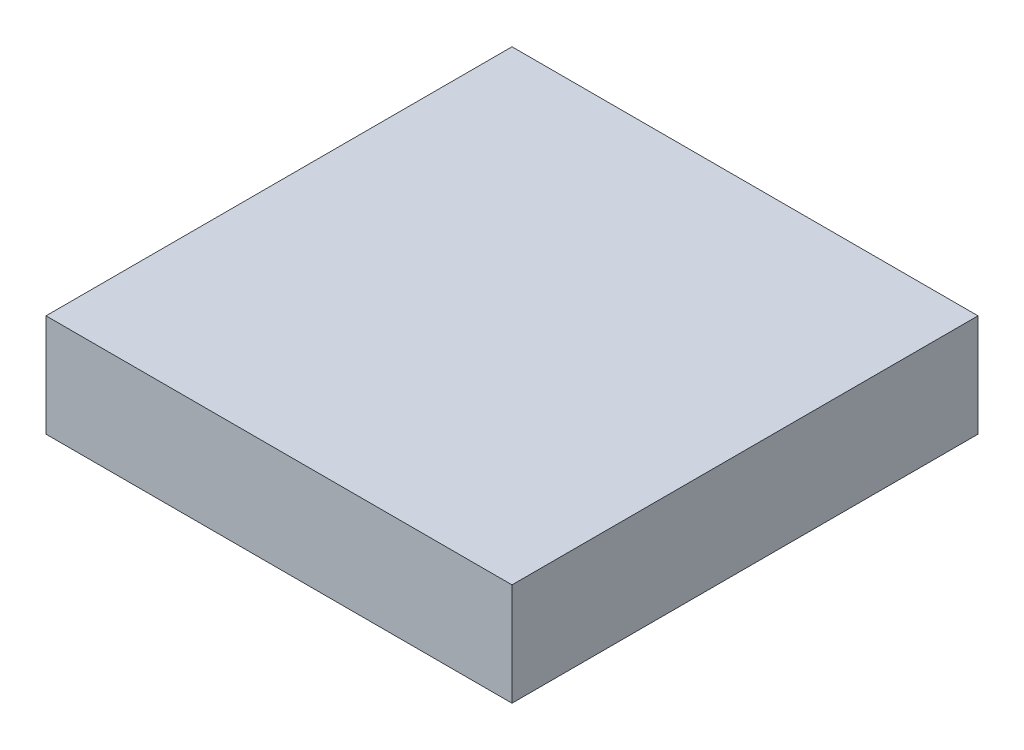
ISO-10303-21;
HEADER;
FILE_DESCRIPTION(('STEP AP214'),'2;1');
FILE_NAME('part.step','',(''),(''),'','','');
FILE_SCHEMA(('AUTOMOTIVE_DESIGN { 1 0 10303 214 1 1 1 1 }'));
ENDSEC;
DATA;
#1=APPLICATION_CONTEXT('core data for automotive mechanical design processes');
#2=APPLICATION_PROTOCOL_DEFINITION('international standard','automotive_design',2000,#1);
#3=PRODUCT_CONTEXT('',#1,'mechanical');
#4=PRODUCT('Part','Part','',(#3));
#5=PRODUCT_RELATED_PRODUCT_CATEGORY('part','',(#4));
#6=PRODUCT_DEFINITION_FORMATION('','',#4);
#7=PRODUCT_DEFINITION_CONTEXT('part definition',#1,'design');
#8=PRODUCT_DEFINITION('design','',#6,#7);
#9=PRODUCT_DEFINITION_SHAPE('','',#8);
#10=(LENGTH_UNIT() NAMED_UNIT(*) SI_UNIT(.MILLI.,.METRE.));
#11=(NAMED_UNIT(*) PLANE_ANGLE_UNIT() SI_UNIT($,.RADIAN.));
#12=(NAMED_UNIT(*) SI_UNIT($,.STERADIAN.) SOLID_ANGLE_UNIT());
#13=UNCERTAINTY_MEASURE_WITH_UNIT(LENGTH_MEASURE(1.E-05),#10,'distance_accuracy_value','');
#14=(GEOMETRIC_REPRESENTATION_CONTEXT(3) GLOBAL_UNCERTAINTY_ASSIGNED_CONTEXT((#13)) GLOBAL_UNIT_ASSIGNED_CONTEXT((#10,
#11,#12)) REPRESENTATION_CONTEXT('',''));
#15=CARTESIAN_POINT('',(0.,0.,0.));
#16=DIRECTION('',(0.,0.,1.));
#17=DIRECTION('',(1.,0.,0.));
#18=AXIS2_PLACEMENT_3D('',#15,#16,#17);
#19=CARTESIAN_POINT('',(75.,33.,75.));
#20=DIRECTION('',(-1.,0.,0.));
#21=DIRECTION('',(0.,0.,1.));
#22=AXIS2_PLACEMENT_3D('',#19,#20,#21);
#23=PLANE('',#22);
#24=DIRECTION('',(0.,0.,-1.));
#25=VECTOR('',#24,1.);
#26=CARTESIAN_POINT('',(75.,0.,75.));
#27=LINE('',#26,#25);
#28=CARTESIAN_POINT('',(75.,0.,75.));
#29=VERTEX_POINT('',#28);
#30=CARTESIAN_POINT('',(75.,0.,-75.));
#31=VERTEX_POINT('',#30);
#32=EDGE_CURVE('E158',#29,#31,#27,.T.);
#33=ORIENTED_EDGE('',*,*,#32,.T.);
#34=DIRECTION('',(0.,-1.,0.));
#35=VECTOR('',#34,1.);
#36=CARTESIAN_POINT('',(75.,33.,-75.));
#37=LINE('',#36,#35);
#38=CARTESIAN_POINT('',(75.,33.,-75.));
#39=VERTEX_POINT('',#38);
#40=EDGE_CURVE('E11',#39,#31,#37,.T.);
#41=ORIENTED_EDGE('',*,*,#40,.F.);
#42=DIRECTION('',(0.,0.,-1.));
#43=VECTOR('',#42,1.);
#44=CARTESIAN_POINT('',(75.,33.,75.));
#45=LINE('',#44,#43);
#46=CARTESIAN_POINT('',(75.,33.,75.));
#47=VERTEX_POINT('',#46);
#48=EDGE_CURVE('E164',#47,#39,#45,.T.);
#49=ORIENTED_EDGE('',*,*,#48,.F.);
#50=DIRECTION('',(0.,-1.,0.));
#51=VECTOR('',#50,1.);
#52=CARTESIAN_POINT('',(75.,33.,75.));
#53=LINE('',#52,#51);
#54=EDGE_CURVE('E174',#47,#29,#53,.T.);
#55=ORIENTED_EDGE('',*,*,#54,.T.);
#56=EDGE_LOOP('',(#33,#41,#49,#55));
#57=FACE_BOUND('',#56,.T.);
#58=ADVANCED_FACE('F39',(#57),#23,.F.);
#59=CARTESIAN_POINT('',(-75.,33.,-75.));
#60=DIRECTION('',(0.,0.,1.));
#61=DIRECTION('',(1.,0.,0.));
#62=AXIS2_PLACEMENT_3D('',#59,#60,#61);
#63=PLANE('',#62);
#64=DIRECTION('',(-1.,0.,0.));
#65=VECTOR('',#64,1.);
#66=CARTESIAN_POINT('',(-75.,0.,-75.));
#67=LINE('',#66,#65);
#68=CARTESIAN_POINT('',(-75.,0.,-75.));
#69=VERTEX_POINT('',#68);
#70=EDGE_CURVE('E178',#31,#69,#67,.T.);
#71=ORIENTED_EDGE('',*,*,#70,.T.);
#72=DIRECTION('',(0.,-1.,0.));
#73=VECTOR('',#72,1.);
#74=CARTESIAN_POINT('',(-75.,33.,-75.));
#75=LINE('',#74,#73);
#76=CARTESIAN_POINT('',(-75.,33.,-75.));
#77=VERTEX_POINT('',#76);
#78=EDGE_CURVE('E47',#77,#69,#75,.T.);
#79=ORIENTED_EDGE('',*,*,#78,.F.);
#80=DIRECTION('',(-1.,0.,0.));
#81=VECTOR('',#80,1.);
#82=CARTESIAN_POINT('',(-75.,33.,-75.));
#83=LINE('',#82,#81);
#84=EDGE_CURVE('E91',#39,#77,#83,.T.);
#85=ORIENTED_EDGE('',*,*,#84,.F.);
#86=ORIENTED_EDGE('',*,*,#40,.T.);
#87=EDGE_LOOP('',(#71,#79,#85,#86));
#88=FACE_BOUND('',#87,.T.);
#89=ADVANCED_FACE('F212',(#88),#63,.F.);
#90=CARTESIAN_POINT('',(-75.,33.,75.));
#91=DIRECTION('',(1.,0.,0.));
#92=DIRECTION('',(0.,0.,-1.));
#93=AXIS2_PLACEMENT_3D('',#90,#91,#92);
#94=PLANE('',#93);
#95=DIRECTION('',(0.,0.,1.));
#96=VECTOR('',#95,1.);
#97=CARTESIAN_POINT('',(-75.,0.,75.));
#98=LINE('',#97,#96);
#99=CARTESIAN_POINT('',(-75.,0.,75.));
#100=VERTEX_POINT('',#99);
#101=EDGE_CURVE('E181',#69,#100,#98,.T.);
#102=ORIENTED_EDGE('',*,*,#101,.T.);
#103=DIRECTION('',(0.,-1.,0.));
#104=VECTOR('',#103,1.);
#105=CARTESIAN_POINT('',(-75.,33.,75.));
#106=LINE('',#105,#104);
#107=CARTESIAN_POINT('',(-75.,33.,75.));
#108=VERTEX_POINT('',#107);
#109=EDGE_CURVE('E188',#108,#100,#106,.T.);
#110=ORIENTED_EDGE('',*,*,#109,.F.);
#111=DIRECTION('',(0.,0.,1.));
#112=VECTOR('',#111,1.);
#113=CARTESIAN_POINT('',(-75.,33.,75.));
#114=LINE('',#113,#112);
#115=EDGE_CURVE('E169',#77,#108,#114,.T.);
#116=ORIENTED_EDGE('',*,*,#115,.F.);
#117=ORIENTED_EDGE('',*,*,#78,.T.);
#118=EDGE_LOOP('',(#102,#110,#116,#117));
#119=FACE_BOUND('',#118,.T.);
#120=ADVANCED_FACE('F195',(#119),#94,.F.);
#121=CARTESIAN_POINT('',(-75.,33.,75.));
#122=DIRECTION('',(0.,0.,-1.));
#123=DIRECTION('',(-1.,0.,0.));
#124=AXIS2_PLACEMENT_3D('',#121,#122,#123);
#125=PLANE('',#124);
#126=DIRECTION('',(1.,0.,0.));
#127=VECTOR('',#126,1.);
#128=CARTESIAN_POINT('',(-75.,0.,75.));
#129=LINE('',#128,#127);
#130=EDGE_CURVE('E84',#100,#29,#129,.T.);
#131=ORIENTED_EDGE('',*,*,#130,.T.);
#132=ORIENTED_EDGE('',*,*,#54,.F.);
#133=DIRECTION('',(1.,0.,0.));
#134=VECTOR('',#133,1.);
#135=CARTESIAN_POINT('',(-75.,33.,75.));
#136=LINE('',#135,#134);
#137=EDGE_CURVE('E63',#108,#47,#136,.T.);
#138=ORIENTED_EDGE('',*,*,#137,.F.);
#139=ORIENTED_EDGE('',*,*,#109,.T.);
#140=EDGE_LOOP('',(#131,#132,#138,#139));
#141=FACE_BOUND('',#140,.T.);
#142=ADVANCED_FACE('F203',(#141),#125,.F.);
#143=CARTESIAN_POINT('',(0.,33.,0.));
#144=DIRECTION('',(0.,-1.,0.));
#145=DIRECTION('',(0.,0.,-1.));
#146=AXIS2_PLACEMENT_3D('',#143,#144,#145);
#147=PLANE('',#146);
#148=ORIENTED_EDGE('',*,*,#48,.T.);
#149=ORIENTED_EDGE('',*,*,#84,.T.);
#150=ORIENTED_EDGE('',*,*,#115,.T.);
#151=ORIENTED_EDGE('',*,*,#137,.T.);
#152=EDGE_LOOP('',(#148,#149,#150,#151));
#153=FACE_BOUND('',#152,.T.);
#154=ADVANCED_FACE('F205',(#153),#147,.F.);
#155=CARTESIAN_POINT('',(0.,0.,0.));
#156=DIRECTION('',(0.,-1.,0.));
#157=DIRECTION('',(0.,0.,-1.));
#158=AXIS2_PLACEMENT_3D('',#155,#156,#157);
#159=PLANE('',#158);
#160=DIRECTION('',(0.,0.,1.));
#161=VECTOR('',#160,1.);
#162=CARTESIAN_POINT('',(69.,0.,-69.));
#163=LINE('',#162,#161);
#164=CARTESIAN_POINT('',(69.,0.,-69.));
#165=VERTEX_POINT('',#164);
#166=CARTESIAN_POINT('',(69.,0.,69.));
#167=VERTEX_POINT('',#166);
#168=EDGE_CURVE('E54',#165,#167,#163,.T.);
#169=ORIENTED_EDGE('',*,*,#168,.F.);
#170=DIRECTION('',(1.,0.,0.));
#171=VECTOR('',#170,1.);
#172=CARTESIAN_POINT('',(-69.,0.,-69.));
#173=LINE('',#172,#171);
#174=CARTESIAN_POINT('',(-69.,0.,-69.));
#175=VERTEX_POINT('',#174);
#176=EDGE_CURVE('E136',#175,#165,#173,.T.);
#177=ORIENTED_EDGE('',*,*,#176,.F.);
#178=DIRECTION('',(0.,0.,-1.));
#179=VECTOR('',#178,1.);
#180=CARTESIAN_POINT('',(-69.,0.,-69.));
#181=LINE('',#180,#179);
#182=CARTESIAN_POINT('',(-69.,0.,69.));
#183=VERTEX_POINT('',#182);
#184=EDGE_CURVE('E140',#183,#175,#181,.T.);
#185=ORIENTED_EDGE('',*,*,#184,.F.);
#186=DIRECTION('',(-1.,0.,0.));
#187=VECTOR('',#186,1.);
#188=CARTESIAN_POINT('',(-69.,0.,69.));
#189=LINE('',#188,#187);
#190=EDGE_CURVE('E149',#167,#183,#189,.T.);
#191=ORIENTED_EDGE('',*,*,#190,.F.);
#192=EDGE_LOOP('',(#169,#177,#185,#191));
#193=FACE_BOUND('',#192,.T.);
#194=ORIENTED_EDGE('',*,*,#32,.F.);
#195=ORIENTED_EDGE('',*,*,#130,.F.);
#196=ORIENTED_EDGE('',*,*,#101,.F.);
#197=ORIENTED_EDGE('',*,*,#70,.F.);
#198=EDGE_LOOP('',(#194,#195,#196,#197));
#199=FACE_BOUND('',#198,.T.);
#200=ADVANCED_FACE('F199',(#193,#199),#159,.T.);
#201=CARTESIAN_POINT('',(69.,12.,-69.));
#202=DIRECTION('',(1.,0.,0.));
#203=DIRECTION('',(0.,0.,-1.));
#204=AXIS2_PLACEMENT_3D('',#201,#202,#203);
#205=PLANE('',#204);
#206=ORIENTED_EDGE('',*,*,#168,.T.);
#207=DIRECTION('',(0.,-1.,0.));
#208=VECTOR('',#207,1.);
#209=CARTESIAN_POINT('',(69.,12.,69.));
#210=LINE('',#209,#208);
#211=CARTESIAN_POINT('',(69.,12.,69.));
#212=VERTEX_POINT('',#211);
#213=EDGE_CURVE('E111',#212,#167,#210,.T.);
#214=ORIENTED_EDGE('',*,*,#213,.F.);
#215=DIRECTION('',(0.,0.,1.));
#216=VECTOR('',#215,1.);
#217=CARTESIAN_POINT('',(69.,12.,-69.));
#218=LINE('',#217,#216);
#219=CARTESIAN_POINT('',(69.,12.,-69.));
#220=VERTEX_POINT('',#219);
#221=EDGE_CURVE('E115',#220,#212,#218,.T.);
#222=ORIENTED_EDGE('',*,*,#221,.F.);
#223=DIRECTION('',(0.,-1.,0.));
#224=VECTOR('',#223,1.);
#225=CARTESIAN_POINT('',(69.,12.,-69.));
#226=LINE('',#225,#224);
#227=EDGE_CURVE('E155',#220,#165,#226,.T.);
#228=ORIENTED_EDGE('',*,*,#227,.T.);
#229=EDGE_LOOP('',(#206,#214,#222,#228));
#230=FACE_BOUND('',#229,.T.);
#231=ADVANCED_FACE('F113',(#230),#205,.F.);
#232=CARTESIAN_POINT('',(-69.,12.,-69.));
#233=DIRECTION('',(0.,0.,-1.));
#234=DIRECTION('',(-1.,0.,0.));
#235=AXIS2_PLACEMENT_3D('',#232,#233,#234);
#236=PLANE('',#235);
#237=ORIENTED_EDGE('',*,*,#176,.T.);
#238=ORIENTED_EDGE('',*,*,#227,.F.);
#239=DIRECTION('',(1.,0.,0.));
#240=VECTOR('',#239,1.);
#241=CARTESIAN_POINT('',(-69.,12.,-69.));
#242=LINE('',#241,#240);
#243=CARTESIAN_POINT('',(-69.,12.,-69.));
#244=VERTEX_POINT('',#243);
#245=EDGE_CURVE('E122',#244,#220,#242,.T.);
#246=ORIENTED_EDGE('',*,*,#245,.F.);
#247=DIRECTION('',(0.,-1.,0.));
#248=VECTOR('',#247,1.);
#249=CARTESIAN_POINT('',(-69.,12.,-69.));
#250=LINE('',#249,#248);
#251=EDGE_CURVE('E159',#244,#175,#250,.T.);
#252=ORIENTED_EDGE('',*,*,#251,.T.);
#253=EDGE_LOOP('',(#237,#238,#246,#252));
#254=FACE_BOUND('',#253,.T.);
#255=ADVANCED_FACE('F252',(#254),#236,.F.);
#256=CARTESIAN_POINT('',(-69.,12.,-69.));
#257=DIRECTION('',(-1.,0.,0.));
#258=DIRECTION('',(0.,0.,1.));
#259=AXIS2_PLACEMENT_3D('',#256,#257,#258);
#260=PLANE('',#259);
#261=ORIENTED_EDGE('',*,*,#184,.T.);
#262=ORIENTED_EDGE('',*,*,#251,.F.);
#263=DIRECTION('',(0.,0.,-1.));
#264=VECTOR('',#263,1.);
#265=CARTESIAN_POINT('',(-69.,12.,-69.));
#266=LINE('',#265,#264);
#267=CARTESIAN_POINT('',(-69.,12.,69.));
#268=VERTEX_POINT('',#267);
#269=EDGE_CURVE('E131',#268,#244,#266,.T.);
#270=ORIENTED_EDGE('',*,*,#269,.F.);
#271=DIRECTION('',(0.,-1.,0.));
#272=VECTOR('',#271,1.);
#273=CARTESIAN_POINT('',(-69.,12.,69.));
#274=LINE('',#273,#272);
#275=EDGE_CURVE('E121',#268,#183,#274,.T.);
#276=ORIENTED_EDGE('',*,*,#275,.T.);
#277=EDGE_LOOP('',(#261,#262,#270,#276));
#278=FACE_BOUND('',#277,.T.);
#279=ADVANCED_FACE('F261',(#278),#260,.F.);
#280=CARTESIAN_POINT('',(-69.,12.,69.));
#281=DIRECTION('',(0.,0.,1.));
#282=DIRECTION('',(1.,0.,0.));
#283=AXIS2_PLACEMENT_3D('',#280,#281,#282);
#284=PLANE('',#283);
#285=ORIENTED_EDGE('',*,*,#190,.T.);
#286=ORIENTED_EDGE('',*,*,#275,.F.);
#287=DIRECTION('',(-1.,0.,0.));
#288=VECTOR('',#287,1.);
#289=CARTESIAN_POINT('',(-69.,12.,69.));
#290=LINE('',#289,#288);
#291=EDGE_CURVE('E125',#212,#268,#290,.T.);
#292=ORIENTED_EDGE('',*,*,#291,.F.);
#293=ORIENTED_EDGE('',*,*,#213,.T.);
#294=EDGE_LOOP('',(#285,#286,#292,#293));
#295=FACE_BOUND('',#294,.T.);
#296=ADVANCED_FACE('F126',(#295),#284,.F.);
#297=CARTESIAN_POINT('',(0.,12.,0.));
#298=DIRECTION('',(0.,1.,0.));
#299=DIRECTION('',(0.,0.,1.));
#300=AXIS2_PLACEMENT_3D('',#297,#298,#299);
#301=PLANE('',#300);
#302=ORIENTED_EDGE('',*,*,#221,.T.);
#303=ORIENTED_EDGE('',*,*,#291,.T.);
#304=ORIENTED_EDGE('',*,*,#269,.T.);
#305=ORIENTED_EDGE('',*,*,#245,.T.);
#306=EDGE_LOOP('',(#302,#303,#304,#305));
#307=FACE_BOUND('',#306,.T.);
#308=ADVANCED_FACE('F133',(#307),#301,.F.);
#309=CLOSED_SHELL('',(#58,#89,#120,#142,#154,#200,#231,#255,#279,#296,#308));
#310=MANIFOLD_SOLID_BREP('B2',#309);
#311=ADVANCED_BREP_SHAPE_REPRESENTATION('',(#18,#310),#14);
#312=SHAPE_DEFINITION_REPRESENTATION(#9,#311);
ENDSEC;
END-ISO-10303-21;
